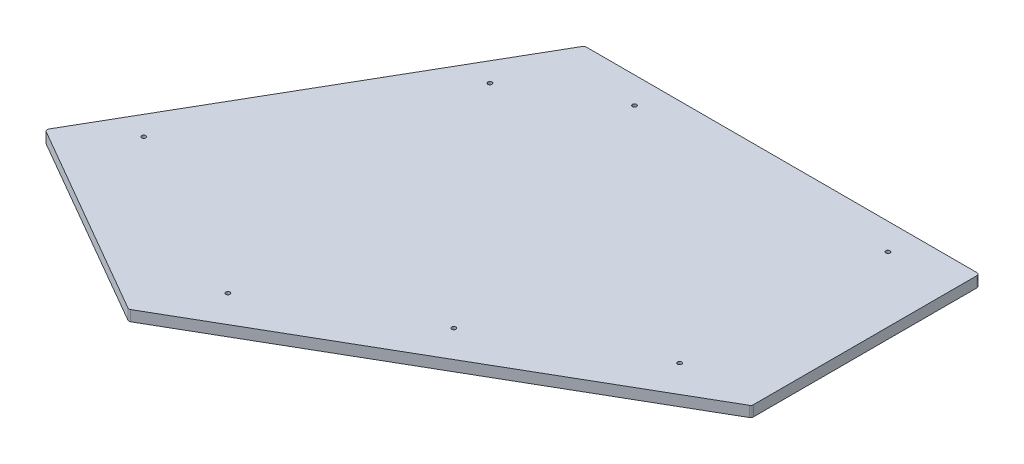
ISO-10303-21;
HEADER;
FILE_DESCRIPTION(('STEP AP214'),'2;1');
FILE_NAME('part.step','',(''),(''),'','','');
FILE_SCHEMA(('AUTOMOTIVE_DESIGN { 1 0 10303 214 1 1 1 1 }'));
ENDSEC;
DATA;
#1=APPLICATION_CONTEXT('core data for automotive mechanical design processes');
#2=APPLICATION_PROTOCOL_DEFINITION('international standard','automotive_design',2000,#1);
#3=PRODUCT_CONTEXT('',#1,'mechanical');
#4=PRODUCT('Part','Part','',(#3));
#5=PRODUCT_RELATED_PRODUCT_CATEGORY('part','',(#4));
#6=PRODUCT_DEFINITION_FORMATION('','',#4);
#7=PRODUCT_DEFINITION_CONTEXT('part definition',#1,'design');
#8=PRODUCT_DEFINITION('design','',#6,#7);
#9=PRODUCT_DEFINITION_SHAPE('','',#8);
#10=(LENGTH_UNIT() NAMED_UNIT(*) SI_UNIT(.MILLI.,.METRE.));
#11=(NAMED_UNIT(*) PLANE_ANGLE_UNIT() SI_UNIT($,.RADIAN.));
#12=(NAMED_UNIT(*) SI_UNIT($,.STERADIAN.) SOLID_ANGLE_UNIT());
#13=UNCERTAINTY_MEASURE_WITH_UNIT(LENGTH_MEASURE(1.E-05),#10,'distance_accuracy_value','');
#14=(GEOMETRIC_REPRESENTATION_CONTEXT(3) GLOBAL_UNCERTAINTY_ASSIGNED_CONTEXT((#13)) GLOBAL_UNIT_ASSIGNED_CONTEXT((#10,
#11,#12)) REPRESENTATION_CONTEXT('',''));
#15=CARTESIAN_POINT('',(0.,0.,0.));
#16=DIRECTION('',(0.,0.,1.));
#17=DIRECTION('',(1.,0.,0.));
#18=AXIS2_PLACEMENT_3D('',#15,#16,#17);
#19=CARTESIAN_POINT('',(0.,12.7,0.));
#20=DIRECTION('',(0.,1.,0.));
#21=DIRECTION('',(0.,0.,1.));
#22=AXIS2_PLACEMENT_3D('',#19,#20,#21);
#23=PLANE('',#22);
#24=CARTESIAN_POINT('',(213.713214706211,12.7,370.159699048508));
#25=DIRECTION('',(0.,1.,0.));
#26=DIRECTION('',(0.,0.,1.));
#27=AXIS2_PLACEMENT_3D('',#24,#25,#26);
#28=CIRCLE('',#27,2.45745000000002);
#29=CARTESIAN_POINT('',(213.713214706211,12.7,372.617149048508));
#30=VERTEX_POINT('',#29);
#31=EDGE_CURVE('E245',#30,#30,#28,.T.);
#32=ORIENTED_EDGE('',*,*,#31,.F.);
#33=EDGE_LOOP('',(#32));
#34=FACE_BOUND('',#33,.T.);
#35=CARTESIAN_POINT('',(394.287600704311,12.7,31.7496055682207));
#36=DIRECTION('',(0.,1.,0.));
#37=DIRECTION('',(0.,0.,1.));
#38=AXIS2_PLACEMENT_3D('',#35,#36,#37);
#39=CIRCLE('',#38,2.45744999999996);
#40=CARTESIAN_POINT('',(394.287600704311,12.7,34.2070555682207));
#41=VERTEX_POINT('',#40);
#42=EDGE_CURVE('E233',#41,#41,#39,.T.);
#43=ORIENTED_EDGE('',*,*,#42,.F.);
#44=EDGE_LOOP('',(#43));
#45=FACE_BOUND('',#44,.T.);
#46=CARTESIAN_POINT('',(-18.1641461086996,12.7,94.9617772273125));
#47=DIRECTION('',(0.,1.,0.));
#48=DIRECTION('',(0.,0.,1.));
#49=AXIS2_PLACEMENT_3D('',#46,#47,#48);
#50=CIRCLE('',#49,2.45744999999995);
#51=CARTESIAN_POINT('',(-18.1641461086996,12.7,97.4192272273125));
#52=VERTEX_POINT('',#51);
#53=EDGE_CURVE('E222',#52,#52,#50,.T.);
#54=ORIENTED_EDGE('',*,*,#53,.F.);
#55=EDGE_LOOP('',(#54));
#56=FACE_BOUND('',#55,.T.);
#57=DIRECTION('',(0.866023972491497,0.,-0.5000024790639));
#58=VECTOR('',#57,1.);
#59=CARTESIAN_POINT('',(-0.199185023168236,12.7,544.989420830469));
#60=LINE('',#59,#58);
#61=CARTESIAN_POINT('',(1.38831204742367,12.7,544.072872910301));
#62=VERTEX_POINT('',#61);
#63=CARTESIAN_POINT('',(470.487608575339,12.7,273.23647733536));
#64=VERTEX_POINT('',#63);
#65=EDGE_CURVE('E155',#62,#64,#60,.T.);
#66=ORIENTED_EDGE('',*,*,#65,.T.);
#67=CARTESIAN_POINT('',(468.900100704311,12.7,270.486851222699));
#68=DIRECTION('',(0.,1.,0.));
#69=DIRECTION('',(0.,0.,1.));
#70=AXIS2_PLACEMENT_3D('',#67,#68,#69);
#71=CIRCLE('',#70,3.175);
#72=CARTESIAN_POINT('',(472.075100704311,12.7,270.486851222699));
#73=VERTEX_POINT('',#72);
#74=EDGE_CURVE('E172',#64,#73,#71,.T.);
#75=ORIENTED_EDGE('',*,*,#74,.T.);
#76=DIRECTION('',(0.,0.,-1.));
#77=VECTOR('',#76,1.);
#78=CARTESIAN_POINT('',(472.075100704311,12.7,89.69375));
#79=LINE('',#78,#77);
#80=CARTESIAN_POINT('',(472.075100704311,12.7,3.175));
#81=VERTEX_POINT('',#80);
#82=EDGE_CURVE('E139',#73,#81,#79,.T.);
#83=ORIENTED_EDGE('',*,*,#82,.T.);
#84=CARTESIAN_POINT('',(468.900100704311,12.7,3.175));
#85=DIRECTION('',(0.,1.,0.));
#86=DIRECTION('',(0.,0.,1.));
#87=AXIS2_PLACEMENT_3D('',#84,#85,#86);
#88=CIRCLE('',#87,3.175);
#89=CARTESIAN_POINT('',(468.900100704311,12.7,0.));
#90=VERTEX_POINT('',#89);
#91=EDGE_CURVE('E166',#81,#90,#88,.T.);
#92=ORIENTED_EDGE('',*,*,#91,.T.);
#93=DIRECTION('',(-1.,0.,0.));
#94=VECTOR('',#93,1.);
#95=CARTESIAN_POINT('',(472.075100704311,12.7,0.));
#96=LINE('',#95,#94);
#97=CARTESIAN_POINT('',(1.83309351682742,12.7,0.));
#98=VERTEX_POINT('',#97);
#99=EDGE_CURVE('E149',#90,#98,#96,.T.);
#100=ORIENTED_EDGE('',*,*,#99,.T.);
#101=CARTESIAN_POINT('',(1.83309351682742,12.7,3.175));
#102=DIRECTION('',(0.,1.,0.));
#103=DIRECTION('',(0.,0.,1.));
#104=AXIS2_PLACEMENT_3D('',#101,#102,#103);
#105=CIRCLE('',#104,3.175);
#106=CARTESIAN_POINT('',(-0.916541949284118,12.7,1.58750832962766));
#107=VERTEX_POINT('',#106);
#108=EDGE_CURVE('E168',#98,#107,#105,.T.);
#109=ORIENTED_EDGE('',*,*,#108,.T.);
#110=DIRECTION('',(-0.499997376495225,0.,0.866026918460328));
#111=VECTOR('',#110,1.);
#112=CARTESIAN_POINT('',(0.,12.7,0.));
#113=LINE('',#112,#111);
#114=CARTESIAN_POINT('',(-234.448820190503,12.7,406.080109278692));
#115=VERTEX_POINT('',#114);
#116=EDGE_CURVE('E217',#107,#115,#113,.T.);
#117=ORIENTED_EDGE('',*,*,#116,.T.);
#118=CARTESIAN_POINT('',(-231.699184724391,12.7,407.667600949065));
#119=DIRECTION('',(0.,1.,0.));
#120=DIRECTION('',(0.,0.,1.));
#121=AXIS2_PLACEMENT_3D('',#118,#119,#120);
#122=CIRCLE('',#121,3.175);
#123=CARTESIAN_POINT('',(-233.286676394763,12.7,410.417236415176));
#124=VERTEX_POINT('',#123);
#125=EDGE_CURVE('E63',#115,#124,#122,.T.);
#126=ORIENTED_EDGE('',*,*,#125,.T.);
#127=DIRECTION('',(0.866026918460328,0.,0.499997376495225));
#128=VECTOR('',#127,1.);
#129=CARTESIAN_POINT('',(-236.036311860875,12.7,408.829744744804));
#130=LINE('',#129,#128);
#131=CARTESIAN_POINT('',(-1.78668749397667,12.7,544.072882263752));
#132=VERTEX_POINT('',#131);
#133=EDGE_CURVE('E214',#124,#132,#130,.T.);
#134=ORIENTED_EDGE('',*,*,#133,.T.);
#135=CARTESIAN_POINT('',(-0.199195823604249,12.7,541.323246797641));
#136=DIRECTION('',(0.,1.,0.));
#137=DIRECTION('',(0.,0.,1.));
#138=AXIS2_PLACEMENT_3D('',#135,#136,#137);
#139=CIRCLE('',#138,3.175);
#140=EDGE_CURVE('E170',#132,#62,#139,.T.);
#141=ORIENTED_EDGE('',*,*,#140,.T.);
#142=EDGE_LOOP('',(#66,#75,#83,#92,#100,#109,#117,#126,#134,#141));
#143=FACE_BOUND('',#142,.T.);
#144=CARTESIAN_POINT('',(-169.646411275637,12.7,357.338592528794));
#145=DIRECTION('',(0.,1.,0.));
#146=DIRECTION('',(0.,0.,1.));
#147=AXIS2_PLACEMENT_3D('',#144,#145,#146);
#148=CIRCLE('',#147,2.45744999999998);
#149=CARTESIAN_POINT('',(-169.646411275637,12.7,359.796042528794));
#150=VERTEX_POINT('',#149);
#151=EDGE_CURVE('E195',#150,#150,#148,.T.);
#152=ORIENTED_EDGE('',*,*,#151,.F.);
#153=EDGE_LOOP('',(#152));
#154=FACE_BOUND('',#153,.T.);
#155=CARTESIAN_POINT('',(91.3214807043114,12.7,31.7496055682207));
#156=DIRECTION('',(0.,1.,0.));
#157=DIRECTION('',(0.,0.,1.));
#158=AXIS2_PLACEMENT_3D('',#155,#156,#157);
#159=CIRCLE('',#158,2.45744999999997);
#160=CARTESIAN_POINT('',(91.3214807043114,12.7,34.2070555682207));
#161=VERTEX_POINT('',#160);
#162=EDGE_CURVE('E227',#161,#161,#159,.T.);
#163=ORIENTED_EDGE('',*,*,#162,.F.);
#164=EDGE_LOOP('',(#163));
#165=FACE_BOUND('',#164,.T.);
#166=CARTESIAN_POINT('',(384.876900704311,12.7,271.337645568221));
#167=DIRECTION('',(0.,1.,0.));
#168=DIRECTION('',(0.,0.,1.));
#169=AXIS2_PLACEMENT_3D('',#166,#167,#168);
#170=CIRCLE('',#169,2.45745000000002);
#171=CARTESIAN_POINT('',(384.876900704311,12.7,273.795095568221));
#172=VERTEX_POINT('',#171);
#173=EDGE_CURVE('E239',#172,#172,#170,.T.);
#174=ORIENTED_EDGE('',*,*,#173,.F.);
#175=EDGE_LOOP('',(#174));
#176=FACE_BOUND('',#175,.T.);
#177=CARTESIAN_POINT('',(42.5495287081099,12.7,468.981752528795));
#178=DIRECTION('',(0.,1.,0.));
#179=DIRECTION('',(0.,0.,1.));
#180=AXIS2_PLACEMENT_3D('',#177,#178,#179);
#181=CIRCLE('',#180,2.45745000000007);
#182=CARTESIAN_POINT('',(42.5495287081099,12.7,471.439202528795));
#183=VERTEX_POINT('',#182);
#184=EDGE_CURVE('E251',#183,#183,#181,.T.);
#185=ORIENTED_EDGE('',*,*,#184,.F.);
#186=EDGE_LOOP('',(#185));
#187=FACE_BOUND('',#186,.T.);
#188=ADVANCED_FACE('F41',(#34,#45,#56,#143,#154,#165,#176,#187),#23,.T.);
#189=CARTESIAN_POINT('',(0.,0.,0.));
#190=DIRECTION('',(0.,1.,0.));
#191=DIRECTION('',(0.,0.,1.));
#192=AXIS2_PLACEMENT_3D('',#189,#190,#191);
#193=PLANE('',#192);
#194=DIRECTION('',(0.,0.,-1.));
#195=VECTOR('',#194,1.);
#196=CARTESIAN_POINT('',(472.075100704311,0.,89.69375));
#197=LINE('',#196,#195);
#198=CARTESIAN_POINT('',(472.075100704311,0.,270.486851222699));
#199=VERTEX_POINT('',#198);
#200=CARTESIAN_POINT('',(472.075100704311,0.,3.17500000000003));
#201=VERTEX_POINT('',#200);
#202=EDGE_CURVE('E136',#199,#201,#197,.T.);
#203=ORIENTED_EDGE('',*,*,#202,.F.);
#204=CARTESIAN_POINT('',(468.900100704311,0.,270.486851222699));
#205=DIRECTION('',(0.,1.,0.));
#206=DIRECTION('',(0.,0.,1.));
#207=AXIS2_PLACEMENT_3D('',#204,#205,#206);
#208=CIRCLE('',#207,3.175);
#209=CARTESIAN_POINT('',(470.487608575339,0.,273.23647733536));
#210=VERTEX_POINT('',#209);
#211=EDGE_CURVE('E119',#199,#210,#208,.F.);
#212=ORIENTED_EDGE('',*,*,#211,.T.);
#213=DIRECTION('',(0.866023972491497,0.,-0.5000024790639));
#214=VECTOR('',#213,1.);
#215=CARTESIAN_POINT('',(-0.199185023168236,0.,544.989420830469));
#216=LINE('',#215,#214);
#217=CARTESIAN_POINT('',(1.38831204742367,0.,544.072872910301));
#218=VERTEX_POINT('',#217);
#219=EDGE_CURVE('E147',#218,#210,#216,.T.);
#220=ORIENTED_EDGE('',*,*,#219,.F.);
#221=CARTESIAN_POINT('',(-0.199195823604249,0.,541.323246797641));
#222=DIRECTION('',(0.,1.,0.));
#223=DIRECTION('',(0.,0.,1.));
#224=AXIS2_PLACEMENT_3D('',#221,#222,#223);
#225=CIRCLE('',#224,3.175);
#226=CARTESIAN_POINT('',(-1.78668749397663,0.,544.072882263752));
#227=VERTEX_POINT('',#226);
#228=EDGE_CURVE('E130',#218,#227,#225,.F.);
#229=ORIENTED_EDGE('',*,*,#228,.T.);
#230=DIRECTION('',(0.866026918460328,0.,0.499997376495225));
#231=VECTOR('',#230,1.);
#232=CARTESIAN_POINT('',(-71.0581838941823,0.,504.079244967144));
#233=LINE('',#232,#231);
#234=CARTESIAN_POINT('',(-233.286676394763,0.,410.417236415176));
#235=VERTEX_POINT('',#234);
#236=EDGE_CURVE('E151',#235,#227,#233,.T.);
#237=ORIENTED_EDGE('',*,*,#236,.F.);
#238=CARTESIAN_POINT('',(-231.699184724391,0.,407.667600949065));
#239=DIRECTION('',(0.,1.,0.));
#240=DIRECTION('',(0.,0.,1.));
#241=AXIS2_PLACEMENT_3D('',#238,#239,#240);
#242=CIRCLE('',#241,3.175);
#243=CARTESIAN_POINT('',(-234.448820190503,0.,406.080109278692));
#244=VERTEX_POINT('',#243);
#245=EDGE_CURVE('E140',#235,#244,#242,.F.);
#246=ORIENTED_EDGE('',*,*,#245,.T.);
#247=DIRECTION('',(-0.499997376495225,0.,0.866026918460328));
#248=VECTOR('',#247,1.);
#249=CARTESIAN_POINT('',(0.,0.,0.));
#250=LINE('',#249,#248);
#251=CARTESIAN_POINT('',(-0.916541949284118,0.,1.58750832962766));
#252=VERTEX_POINT('',#251);
#253=EDGE_CURVE('E194',#252,#244,#250,.T.);
#254=ORIENTED_EDGE('',*,*,#253,.F.);
#255=CARTESIAN_POINT('',(1.83309351682742,0.,3.175));
#256=DIRECTION('',(0.,1.,0.));
#257=DIRECTION('',(0.,0.,1.));
#258=AXIS2_PLACEMENT_3D('',#255,#256,#257);
#259=CIRCLE('',#258,3.175);
#260=CARTESIAN_POINT('',(1.83309351682742,0.,0.));
#261=VERTEX_POINT('',#260);
#262=EDGE_CURVE('E159',#252,#261,#259,.F.);
#263=ORIENTED_EDGE('',*,*,#262,.T.);
#264=DIRECTION('',(-1.,0.,0.));
#265=VECTOR('',#264,1.);
#266=CARTESIAN_POINT('',(472.075100704311,0.,0.));
#267=LINE('',#266,#265);
#268=CARTESIAN_POINT('',(468.900100704311,0.,0.));
#269=VERTEX_POINT('',#268);
#270=EDGE_CURVE('E188',#269,#261,#267,.T.);
#271=ORIENTED_EDGE('',*,*,#270,.F.);
#272=CARTESIAN_POINT('',(468.900100704311,0.,3.175));
#273=DIRECTION('',(0.,1.,0.));
#274=DIRECTION('',(0.,0.,1.));
#275=AXIS2_PLACEMENT_3D('',#272,#273,#274);
#276=CIRCLE('',#275,3.175);
#277=EDGE_CURVE('E146',#269,#201,#276,.F.);
#278=ORIENTED_EDGE('',*,*,#277,.T.);
#279=EDGE_LOOP('',(#203,#212,#220,#229,#237,#246,#254,#263,#271,#278));
#280=FACE_BOUND('',#279,.T.);
#281=CARTESIAN_POINT('',(-169.646411275637,0.,357.338592528794));
#282=DIRECTION('',(0.,1.,0.));
#283=DIRECTION('',(0.,0.,1.));
#284=AXIS2_PLACEMENT_3D('',#281,#282,#283);
#285=CIRCLE('',#284,2.45744999999998);
#286=CARTESIAN_POINT('',(-169.646411275637,0.,359.796042528794));
#287=VERTEX_POINT('',#286);
#288=EDGE_CURVE('E200',#287,#287,#285,.T.);
#289=ORIENTED_EDGE('',*,*,#288,.T.);
#290=EDGE_LOOP('',(#289));
#291=FACE_BOUND('',#290,.T.);
#292=CARTESIAN_POINT('',(-18.1641461086996,0.,94.9617772273125));
#293=DIRECTION('',(0.,1.,0.));
#294=DIRECTION('',(0.,0.,1.));
#295=AXIS2_PLACEMENT_3D('',#292,#293,#294);
#296=CIRCLE('',#295,2.45744999999995);
#297=CARTESIAN_POINT('',(-18.1641461086996,0.,97.4192272273125));
#298=VERTEX_POINT('',#297);
#299=EDGE_CURVE('E224',#298,#298,#296,.T.);
#300=ORIENTED_EDGE('',*,*,#299,.T.);
#301=EDGE_LOOP('',(#300));
#302=FACE_BOUND('',#301,.T.);
#303=CARTESIAN_POINT('',(91.3214807043114,0.,31.7496055682207));
#304=DIRECTION('',(0.,1.,0.));
#305=DIRECTION('',(0.,0.,1.));
#306=AXIS2_PLACEMENT_3D('',#303,#304,#305);
#307=CIRCLE('',#306,2.45744999999997);
#308=CARTESIAN_POINT('',(91.3214807043114,0.,34.2070555682207));
#309=VERTEX_POINT('',#308);
#310=EDGE_CURVE('E230',#309,#309,#307,.T.);
#311=ORIENTED_EDGE('',*,*,#310,.T.);
#312=EDGE_LOOP('',(#311));
#313=FACE_BOUND('',#312,.T.);
#314=CARTESIAN_POINT('',(394.287600704311,0.,31.7496055682207));
#315=DIRECTION('',(0.,1.,0.));
#316=DIRECTION('',(0.,0.,1.));
#317=AXIS2_PLACEMENT_3D('',#314,#315,#316);
#318=CIRCLE('',#317,2.45744999999996);
#319=CARTESIAN_POINT('',(394.287600704311,0.,34.2070555682207));
#320=VERTEX_POINT('',#319);
#321=EDGE_CURVE('E236',#320,#320,#318,.T.);
#322=ORIENTED_EDGE('',*,*,#321,.T.);
#323=EDGE_LOOP('',(#322));
#324=FACE_BOUND('',#323,.T.);
#325=CARTESIAN_POINT('',(384.876900704311,0.,271.337645568221));
#326=DIRECTION('',(0.,1.,0.));
#327=DIRECTION('',(0.,0.,1.));
#328=AXIS2_PLACEMENT_3D('',#325,#326,#327);
#329=CIRCLE('',#328,2.45745000000002);
#330=CARTESIAN_POINT('',(384.876900704311,0.,273.795095568221));
#331=VERTEX_POINT('',#330);
#332=EDGE_CURVE('E242',#331,#331,#329,.T.);
#333=ORIENTED_EDGE('',*,*,#332,.T.);
#334=EDGE_LOOP('',(#333));
#335=FACE_BOUND('',#334,.T.);
#336=CARTESIAN_POINT('',(213.713214706211,0.,370.159699048508));
#337=DIRECTION('',(0.,1.,0.));
#338=DIRECTION('',(0.,0.,1.));
#339=AXIS2_PLACEMENT_3D('',#336,#337,#338);
#340=CIRCLE('',#339,2.45745000000002);
#341=CARTESIAN_POINT('',(213.713214706211,0.,372.617149048508));
#342=VERTEX_POINT('',#341);
#343=EDGE_CURVE('E248',#342,#342,#340,.T.);
#344=ORIENTED_EDGE('',*,*,#343,.T.);
#345=EDGE_LOOP('',(#344));
#346=FACE_BOUND('',#345,.T.);
#347=CARTESIAN_POINT('',(42.5495287081099,0.,468.981752528795));
#348=DIRECTION('',(0.,1.,0.));
#349=DIRECTION('',(0.,0.,1.));
#350=AXIS2_PLACEMENT_3D('',#347,#348,#349);
#351=CIRCLE('',#350,2.45745000000007);
#352=CARTESIAN_POINT('',(42.5495287081099,0.,471.439202528795));
#353=VERTEX_POINT('',#352);
#354=EDGE_CURVE('E254',#353,#353,#351,.T.);
#355=ORIENTED_EDGE('',*,*,#354,.T.);
#356=EDGE_LOOP('',(#355));
#357=FACE_BOUND('',#356,.T.);
#358=ADVANCED_FACE('F143',(#280,#291,#302,#313,#324,#335,#346,#357),#193,.F.);
#359=CARTESIAN_POINT('',(472.075100704311,12.7,0.));
#360=DIRECTION('',(0.,0.,1.));
#361=DIRECTION('',(1.,0.,0.));
#362=AXIS2_PLACEMENT_3D('',#359,#360,#361);
#363=PLANE('',#362);
#364=ORIENTED_EDGE('',*,*,#270,.T.);
#365=DIRECTION('',(0.,-1.,0.));
#366=VECTOR('',#365,1.);
#367=CARTESIAN_POINT('',(1.83309351682742,12.7,0.));
#368=LINE('',#367,#366);
#369=EDGE_CURVE('E11',#261,#98,#368,.F.);
#370=ORIENTED_EDGE('',*,*,#369,.T.);
#371=ORIENTED_EDGE('',*,*,#99,.F.);
#372=DIRECTION('',(0.,-1.,0.));
#373=VECTOR('',#372,1.);
#374=CARTESIAN_POINT('',(468.900100704311,12.7,0.));
#375=LINE('',#374,#373);
#376=EDGE_CURVE('E49',#90,#269,#375,.T.);
#377=ORIENTED_EDGE('',*,*,#376,.T.);
#378=EDGE_LOOP('',(#364,#370,#371,#377));
#379=FACE_BOUND('',#378,.T.);
#380=ADVANCED_FACE('F187',(#379),#363,.F.);
#381=CARTESIAN_POINT('',(0.,12.7,0.));
#382=DIRECTION('',(0.866026918460328,0.,0.499997376495225));
#383=DIRECTION('',(0.499997376495225,0.,-0.866026918460328));
#384=AXIS2_PLACEMENT_3D('',#381,#382,#383);
#385=PLANE('',#384);
#386=ORIENTED_EDGE('',*,*,#116,.F.);
#387=DIRECTION('',(0.,-1.,0.));
#388=VECTOR('',#387,1.);
#389=CARTESIAN_POINT('',(-0.916541949284118,12.7,1.58750832962766));
#390=LINE('',#389,#388);
#391=EDGE_CURVE('E180',#107,#252,#390,.T.);
#392=ORIENTED_EDGE('',*,*,#391,.T.);
#393=ORIENTED_EDGE('',*,*,#253,.T.);
#394=DIRECTION('',(0.,-1.,0.));
#395=VECTOR('',#394,1.);
#396=CARTESIAN_POINT('',(-234.448820190503,12.7,406.080109278692));
#397=LINE('',#396,#395);
#398=EDGE_CURVE('E178',#244,#115,#397,.F.);
#399=ORIENTED_EDGE('',*,*,#398,.T.);
#400=EDGE_LOOP('',(#386,#392,#393,#399));
#401=FACE_BOUND('',#400,.T.);
#402=ADVANCED_FACE('F283',(#401),#385,.F.);
#403=CARTESIAN_POINT('',(-71.0581838941823,12.7,504.079244967144));
#404=DIRECTION('',(0.499997376495225,0.,-0.866026918460328));
#405=DIRECTION('',(-0.866026918460328,0.,-0.499997376495225));
#406=AXIS2_PLACEMENT_3D('',#403,#404,#405);
#407=PLANE('',#406);
#408=ORIENTED_EDGE('',*,*,#236,.T.);
#409=DIRECTION('',(0.,-1.,0.));
#410=VECTOR('',#409,1.);
#411=CARTESIAN_POINT('',(-1.7866874939766,12.7,544.072882263752));
#412=LINE('',#411,#410);
#413=EDGE_CURVE('E56',#227,#132,#412,.F.);
#414=ORIENTED_EDGE('',*,*,#413,.T.);
#415=ORIENTED_EDGE('',*,*,#133,.F.);
#416=DIRECTION('',(0.,-1.,0.));
#417=VECTOR('',#416,1.);
#418=CARTESIAN_POINT('',(-233.286676394763,12.7,410.417236415176));
#419=LINE('',#418,#417);
#420=EDGE_CURVE('E174',#124,#235,#419,.T.);
#421=ORIENTED_EDGE('',*,*,#420,.T.);
#422=EDGE_LOOP('',(#408,#414,#415,#421));
#423=FACE_BOUND('',#422,.T.);
#424=ADVANCED_FACE('F205',(#423),#407,.F.);
#425=CARTESIAN_POINT('',(-0.199185023168236,12.7,544.989420830469));
#426=DIRECTION('',(-0.5000024790639,0.,-0.866023972491497));
#427=DIRECTION('',(-0.866023972491498,0.,0.5000024790639));
#428=AXIS2_PLACEMENT_3D('',#425,#426,#427);
#429=PLANE('',#428);
#430=ORIENTED_EDGE('',*,*,#219,.T.);
#431=DIRECTION('',(0.,-1.,0.));
#432=VECTOR('',#431,1.);
#433=CARTESIAN_POINT('',(470.487608575339,12.7,273.23647733536));
#434=LINE('',#433,#432);
#435=EDGE_CURVE('E124',#210,#64,#434,.F.);
#436=ORIENTED_EDGE('',*,*,#435,.T.);
#437=ORIENTED_EDGE('',*,*,#65,.F.);
#438=DIRECTION('',(0.,-1.,0.));
#439=VECTOR('',#438,1.);
#440=CARTESIAN_POINT('',(1.38831204742366,12.7,544.072872910301));
#441=LINE('',#440,#439);
#442=EDGE_CURVE('E129',#62,#218,#441,.T.);
#443=ORIENTED_EDGE('',*,*,#442,.T.);
#444=EDGE_LOOP('',(#430,#436,#437,#443));
#445=FACE_BOUND('',#444,.T.);
#446=ADVANCED_FACE('F216',(#445),#429,.F.);
#447=CARTESIAN_POINT('',(472.075100704311,12.7,89.69375));
#448=DIRECTION('',(-1.,0.,0.));
#449=DIRECTION('',(0.,0.,1.));
#450=AXIS2_PLACEMENT_3D('',#447,#448,#449);
#451=PLANE('',#450);
#452=ORIENTED_EDGE('',*,*,#82,.F.);
#453=DIRECTION('',(0.,-1.,0.));
#454=VECTOR('',#453,1.);
#455=CARTESIAN_POINT('',(472.075100704311,12.7,270.486851222699));
#456=LINE('',#455,#454);
#457=EDGE_CURVE('E123',#73,#199,#456,.T.);
#458=ORIENTED_EDGE('',*,*,#457,.T.);
#459=ORIENTED_EDGE('',*,*,#202,.T.);
#460=DIRECTION('',(0.,-1.,0.));
#461=VECTOR('',#460,1.);
#462=CARTESIAN_POINT('',(472.075100704311,12.7,3.175));
#463=LINE('',#462,#461);
#464=EDGE_CURVE('E141',#201,#81,#463,.F.);
#465=ORIENTED_EDGE('',*,*,#464,.T.);
#466=EDGE_LOOP('',(#452,#458,#459,#465));
#467=FACE_BOUND('',#466,.T.);
#468=ADVANCED_FACE('F135',(#467),#451,.F.);
#469=CARTESIAN_POINT('',(-169.646411275637,12.7,357.338592528794));
#470=DIRECTION('',(0.,-1.,0.));
#471=DIRECTION('',(0.,0.,-1.));
#472=AXIS2_PLACEMENT_3D('',#469,#470,#471);
#473=CYLINDRICAL_SURFACE('',#472,2.45744999999998);
#474=ORIENTED_EDGE('',*,*,#151,.T.);
#475=EDGE_LOOP('',(#474));
#476=FACE_BOUND('',#475,.T.);
#477=ORIENTED_EDGE('',*,*,#288,.F.);
#478=EDGE_LOOP('',(#477));
#479=FACE_BOUND('',#478,.T.);
#480=ADVANCED_FACE('F274',(#476,#479),#473,.F.);
#481=CARTESIAN_POINT('',(-18.1641461086996,12.7,94.9617772273125));
#482=DIRECTION('',(0.,-1.,0.));
#483=DIRECTION('',(0.,0.,-1.));
#484=AXIS2_PLACEMENT_3D('',#481,#482,#483);
#485=CYLINDRICAL_SURFACE('',#484,2.45744999999995);
#486=ORIENTED_EDGE('',*,*,#53,.T.);
#487=EDGE_LOOP('',(#486));
#488=FACE_BOUND('',#487,.T.);
#489=ORIENTED_EDGE('',*,*,#299,.F.);
#490=EDGE_LOOP('',(#489));
#491=FACE_BOUND('',#490,.T.);
#492=ADVANCED_FACE('F359',(#488,#491),#485,.F.);
#493=CARTESIAN_POINT('',(91.3214807043114,12.7,31.7496055682207));
#494=DIRECTION('',(0.,-1.,0.));
#495=DIRECTION('',(0.,0.,-1.));
#496=AXIS2_PLACEMENT_3D('',#493,#494,#495);
#497=CYLINDRICAL_SURFACE('',#496,2.45744999999997);
#498=ORIENTED_EDGE('',*,*,#162,.T.);
#499=EDGE_LOOP('',(#498));
#500=FACE_BOUND('',#499,.T.);
#501=ORIENTED_EDGE('',*,*,#310,.F.);
#502=EDGE_LOOP('',(#501));
#503=FACE_BOUND('',#502,.T.);
#504=ADVANCED_FACE('F351',(#500,#503),#497,.F.);
#505=CARTESIAN_POINT('',(394.287600704311,12.7,31.7496055682207));
#506=DIRECTION('',(0.,-1.,0.));
#507=DIRECTION('',(0.,0.,-1.));
#508=AXIS2_PLACEMENT_3D('',#505,#506,#507);
#509=CYLINDRICAL_SURFACE('',#508,2.45744999999996);
#510=ORIENTED_EDGE('',*,*,#42,.T.);
#511=EDGE_LOOP('',(#510));
#512=FACE_BOUND('',#511,.T.);
#513=ORIENTED_EDGE('',*,*,#321,.F.);
#514=EDGE_LOOP('',(#513));
#515=FACE_BOUND('',#514,.T.);
#516=ADVANCED_FACE('F343',(#512,#515),#509,.F.);
#517=CARTESIAN_POINT('',(384.876900704311,12.7,271.337645568221));
#518=DIRECTION('',(0.,-1.,0.));
#519=DIRECTION('',(0.,0.,-1.));
#520=AXIS2_PLACEMENT_3D('',#517,#518,#519);
#521=CYLINDRICAL_SURFACE('',#520,2.45745000000002);
#522=ORIENTED_EDGE('',*,*,#173,.T.);
#523=EDGE_LOOP('',(#522));
#524=FACE_BOUND('',#523,.T.);
#525=ORIENTED_EDGE('',*,*,#332,.F.);
#526=EDGE_LOOP('',(#525));
#527=FACE_BOUND('',#526,.T.);
#528=ADVANCED_FACE('F335',(#524,#527),#521,.F.);
#529=CARTESIAN_POINT('',(213.713214706211,12.7,370.159699048508));
#530=DIRECTION('',(0.,-1.,0.));
#531=DIRECTION('',(0.,0.,-1.));
#532=AXIS2_PLACEMENT_3D('',#529,#530,#531);
#533=CYLINDRICAL_SURFACE('',#532,2.45745000000002);
#534=ORIENTED_EDGE('',*,*,#31,.T.);
#535=EDGE_LOOP('',(#534));
#536=FACE_BOUND('',#535,.T.);
#537=ORIENTED_EDGE('',*,*,#343,.F.);
#538=EDGE_LOOP('',(#537));
#539=FACE_BOUND('',#538,.T.);
#540=ADVANCED_FACE('F328',(#536,#539),#533,.F.);
#541=CARTESIAN_POINT('',(42.5495287081099,12.7,468.981752528795));
#542=DIRECTION('',(0.,-1.,0.));
#543=DIRECTION('',(0.,0.,-1.));
#544=AXIS2_PLACEMENT_3D('',#541,#542,#543);
#545=CYLINDRICAL_SURFACE('',#544,2.45745000000007);
#546=ORIENTED_EDGE('',*,*,#184,.T.);
#547=EDGE_LOOP('',(#546));
#548=FACE_BOUND('',#547,.T.);
#549=ORIENTED_EDGE('',*,*,#354,.F.);
#550=EDGE_LOOP('',(#549));
#551=FACE_BOUND('',#550,.T.);
#552=ADVANCED_FACE('F260',(#548,#551),#545,.F.);
#553=CARTESIAN_POINT('',(468.900100704311,12.7,270.486851222699));
#554=DIRECTION('',(0.,-1.,0.));
#555=DIRECTION('',(0.,0.,-1.));
#556=AXIS2_PLACEMENT_3D('',#553,#554,#555);
#557=CYLINDRICAL_SURFACE('',#556,3.175);
#558=ORIENTED_EDGE('',*,*,#74,.F.);
#559=ORIENTED_EDGE('',*,*,#435,.F.);
#560=ORIENTED_EDGE('',*,*,#211,.F.);
#561=ORIENTED_EDGE('',*,*,#457,.F.);
#562=EDGE_LOOP('',(#558,#559,#560,#561));
#563=FACE_BOUND('',#562,.T.);
#564=ADVANCED_FACE('F122',(#563),#557,.T.);
#565=CARTESIAN_POINT('',(-0.199195823604249,12.7,541.323246797641));
#566=DIRECTION('',(0.,-1.,0.));
#567=DIRECTION('',(0.,0.,-1.));
#568=AXIS2_PLACEMENT_3D('',#565,#566,#567);
#569=CYLINDRICAL_SURFACE('',#568,3.175);
#570=ORIENTED_EDGE('',*,*,#140,.F.);
#571=ORIENTED_EDGE('',*,*,#413,.F.);
#572=ORIENTED_EDGE('',*,*,#228,.F.);
#573=ORIENTED_EDGE('',*,*,#442,.F.);
#574=EDGE_LOOP('',(#570,#571,#572,#573));
#575=FACE_BOUND('',#574,.T.);
#576=ADVANCED_FACE('F209',(#575),#569,.T.);
#577=CARTESIAN_POINT('',(1.83309351682742,12.7,3.175));
#578=DIRECTION('',(0.,-1.,0.));
#579=DIRECTION('',(0.,0.,-1.));
#580=AXIS2_PLACEMENT_3D('',#577,#578,#579);
#581=CYLINDRICAL_SURFACE('',#580,3.175);
#582=ORIENTED_EDGE('',*,*,#108,.F.);
#583=ORIENTED_EDGE('',*,*,#369,.F.);
#584=ORIENTED_EDGE('',*,*,#262,.F.);
#585=ORIENTED_EDGE('',*,*,#391,.F.);
#586=EDGE_LOOP('',(#582,#583,#584,#585));
#587=FACE_BOUND('',#586,.T.);
#588=ADVANCED_FACE('F293',(#587),#581,.T.);
#589=CARTESIAN_POINT('',(468.900100704311,12.7,3.175));
#590=DIRECTION('',(0.,-1.,0.));
#591=DIRECTION('',(0.,0.,-1.));
#592=AXIS2_PLACEMENT_3D('',#589,#590,#591);
#593=CYLINDRICAL_SURFACE('',#592,3.175);
#594=ORIENTED_EDGE('',*,*,#91,.F.);
#595=ORIENTED_EDGE('',*,*,#464,.F.);
#596=ORIENTED_EDGE('',*,*,#277,.F.);
#597=ORIENTED_EDGE('',*,*,#376,.F.);
#598=EDGE_LOOP('',(#594,#595,#596,#597));
#599=FACE_BOUND('',#598,.T.);
#600=ADVANCED_FACE('F295',(#599),#593,.T.);
#601=CARTESIAN_POINT('',(-231.699184724391,12.7,407.667600949065));
#602=DIRECTION('',(0.,-1.,0.));
#603=DIRECTION('',(0.,0.,-1.));
#604=AXIS2_PLACEMENT_3D('',#601,#602,#603);
#605=CYLINDRICAL_SURFACE('',#604,3.175);
#606=ORIENTED_EDGE('',*,*,#125,.F.);
#607=ORIENTED_EDGE('',*,*,#398,.F.);
#608=ORIENTED_EDGE('',*,*,#245,.F.);
#609=ORIENTED_EDGE('',*,*,#420,.F.);
#610=EDGE_LOOP('',(#606,#607,#608,#609));
#611=FACE_BOUND('',#610,.T.);
#612=ADVANCED_FACE('F43',(#611),#605,.T.);
#613=CLOSED_SHELL('',(#188,#358,#380,#402,#424,#446,#468,#480,#492,#504,#516,#528,#540,#552,
#564,#576,#588,#600,#612));
#614=MANIFOLD_SOLID_BREP('B2',#613);
#615=ADVANCED_BREP_SHAPE_REPRESENTATION('',(#18,#614),#14);
#616=SHAPE_DEFINITION_REPRESENTATION(#9,#615);
ENDSEC;
END-ISO-10303-21;
